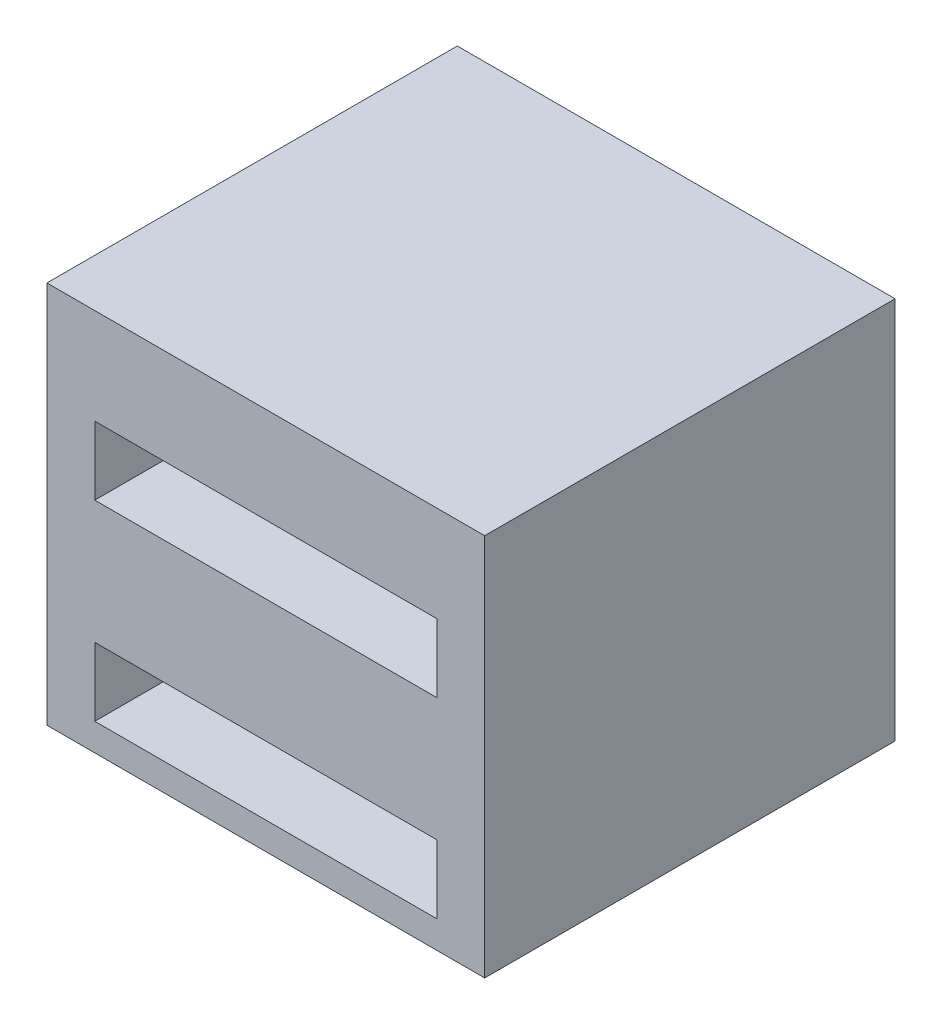
ISO-10303-21;
HEADER;
FILE_DESCRIPTION(('STEP AP214'),'2;1');
FILE_NAME('part.step','',(''),(''),'','','');
FILE_SCHEMA(('AUTOMOTIVE_DESIGN { 1 0 10303 214 1 1 1 1 }'));
ENDSEC;
DATA;
#1=APPLICATION_CONTEXT('core data for automotive mechanical design processes');
#2=APPLICATION_PROTOCOL_DEFINITION('international standard','automotive_design',2000,#1);
#3=PRODUCT_CONTEXT('',#1,'mechanical');
#4=PRODUCT('Part','Part','',(#3));
#5=PRODUCT_RELATED_PRODUCT_CATEGORY('part','',(#4));
#6=PRODUCT_DEFINITION_FORMATION('','',#4);
#7=PRODUCT_DEFINITION_CONTEXT('part definition',#1,'design');
#8=PRODUCT_DEFINITION('design','',#6,#7);
#9=PRODUCT_DEFINITION_SHAPE('','',#8);
#10=(LENGTH_UNIT() NAMED_UNIT(*) SI_UNIT(.MILLI.,.METRE.));
#11=(NAMED_UNIT(*) PLANE_ANGLE_UNIT() SI_UNIT($,.RADIAN.));
#12=(NAMED_UNIT(*) SI_UNIT($,.STERADIAN.) SOLID_ANGLE_UNIT());
#13=UNCERTAINTY_MEASURE_WITH_UNIT(LENGTH_MEASURE(1.E-05),#10,'distance_accuracy_value','');
#14=(GEOMETRIC_REPRESENTATION_CONTEXT(3) GLOBAL_UNCERTAINTY_ASSIGNED_CONTEXT((#13)) GLOBAL_UNIT_ASSIGNED_CONTEXT((#10,
#11,#12)) REPRESENTATION_CONTEXT('',''));
#15=CARTESIAN_POINT('',(0.,0.,0.));
#16=DIRECTION('',(0.,0.,1.));
#17=DIRECTION('',(1.,0.,0.));
#18=AXIS2_PLACEMENT_3D('',#15,#16,#17);
#19=CARTESIAN_POINT('',(30.,1120.,-600.));
#20=DIRECTION('',(-1.,0.,0.));
#21=DIRECTION('',(0.,0.,1.));
#22=AXIS2_PLACEMENT_3D('',#19,#20,#21);
#23=PLANE('',#22);
#24=DIRECTION('',(0.,-1.,0.));
#25=VECTOR('',#24,1.);
#26=CARTESIAN_POINT('',(30.,1120.,0.));
#27=LINE('',#26,#25);
#28=CARTESIAN_POINT('',(30.,1680.,0.));
#29=VERTEX_POINT('',#28);
#30=CARTESIAN_POINT('',(30.,1120.,0.));
#31=VERTEX_POINT('',#30);
#32=EDGE_CURVE('E171',#29,#31,#27,.T.);
#33=ORIENTED_EDGE('',*,*,#32,.F.);
#34=DIRECTION('',(0.,0.,1.));
#35=VECTOR('',#34,1.);
#36=CARTESIAN_POINT('',(30.,1680.,-600.));
#37=LINE('',#36,#35);
#38=CARTESIAN_POINT('',(30.,1680.,-600.));
#39=VERTEX_POINT('',#38);
#40=EDGE_CURVE('E203',#39,#29,#37,.T.);
#41=ORIENTED_EDGE('',*,*,#40,.F.);
#42=DIRECTION('',(0.,-1.,0.));
#43=VECTOR('',#42,1.);
#44=CARTESIAN_POINT('',(30.,1120.,-600.));
#45=LINE('',#44,#43);
#46=CARTESIAN_POINT('',(30.,1120.,-600.));
#47=VERTEX_POINT('',#46);
#48=EDGE_CURVE('E179',#39,#47,#45,.T.);
#49=ORIENTED_EDGE('',*,*,#48,.T.);
#50=DIRECTION('',(0.,0.,1.));
#51=VECTOR('',#50,1.);
#52=CARTESIAN_POINT('',(30.,1120.,-600.));
#53=LINE('',#52,#51);
#54=EDGE_CURVE('E192',#47,#31,#53,.T.);
#55=ORIENTED_EDGE('',*,*,#54,.T.);
#56=EDGE_LOOP('',(#33,#41,#49,#55));
#57=FACE_BOUND('',#56,.T.);
#58=ADVANCED_FACE('F39',(#57),#23,.T.);
#59=CARTESIAN_POINT('',(30.,1680.,-600.));
#60=DIRECTION('',(0.,1.,0.));
#61=DIRECTION('',(0.,0.,1.));
#62=AXIS2_PLACEMENT_3D('',#59,#60,#61);
#63=PLANE('',#62);
#64=DIRECTION('',(-1.,0.,0.));
#65=VECTOR('',#64,1.);
#66=CARTESIAN_POINT('',(30.,1680.,0.));
#67=LINE('',#66,#65);
#68=CARTESIAN_POINT('',(670.,1680.,0.));
#69=VERTEX_POINT('',#68);
#70=EDGE_CURVE('E183',#69,#29,#67,.T.);
#71=ORIENTED_EDGE('',*,*,#70,.F.);
#72=DIRECTION('',(0.,0.,1.));
#73=VECTOR('',#72,1.);
#74=CARTESIAN_POINT('',(670.,1680.,-600.));
#75=LINE('',#74,#73);
#76=CARTESIAN_POINT('',(670.,1680.,-600.));
#77=VERTEX_POINT('',#76);
#78=EDGE_CURVE('E206',#77,#69,#75,.T.);
#79=ORIENTED_EDGE('',*,*,#78,.F.);
#80=DIRECTION('',(-1.,0.,0.));
#81=VECTOR('',#80,1.);
#82=CARTESIAN_POINT('',(30.,1680.,-600.));
#83=LINE('',#82,#81);
#84=EDGE_CURVE('E189',#77,#39,#83,.T.);
#85=ORIENTED_EDGE('',*,*,#84,.T.);
#86=ORIENTED_EDGE('',*,*,#40,.T.);
#87=EDGE_LOOP('',(#71,#79,#85,#86));
#88=FACE_BOUND('',#87,.T.);
#89=ADVANCED_FACE('F243',(#88),#63,.T.);
#90=CARTESIAN_POINT('',(670.,1120.,-600.));
#91=DIRECTION('',(1.,0.,0.));
#92=DIRECTION('',(0.,0.,-1.));
#93=AXIS2_PLACEMENT_3D('',#90,#91,#92);
#94=PLANE('',#93);
#95=DIRECTION('',(0.,1.,0.));
#96=VECTOR('',#95,1.);
#97=CARTESIAN_POINT('',(670.,1120.,0.));
#98=LINE('',#97,#96);
#99=CARTESIAN_POINT('',(670.,1120.,0.));
#100=VERTEX_POINT('',#99);
#101=EDGE_CURVE('E198',#100,#69,#98,.T.);
#102=ORIENTED_EDGE('',*,*,#101,.F.);
#103=DIRECTION('',(0.,0.,1.));
#104=VECTOR('',#103,1.);
#105=CARTESIAN_POINT('',(670.,1120.,-600.));
#106=LINE('',#105,#104);
#107=CARTESIAN_POINT('',(670.,1120.,-600.));
#108=VERTEX_POINT('',#107);
#109=EDGE_CURVE('E208',#108,#100,#106,.T.);
#110=ORIENTED_EDGE('',*,*,#109,.F.);
#111=DIRECTION('',(0.,1.,0.));
#112=VECTOR('',#111,1.);
#113=CARTESIAN_POINT('',(670.,1120.,-600.));
#114=LINE('',#113,#112);
#115=EDGE_CURVE('E186',#108,#77,#114,.T.);
#116=ORIENTED_EDGE('',*,*,#115,.T.);
#117=ORIENTED_EDGE('',*,*,#78,.T.);
#118=EDGE_LOOP('',(#102,#110,#116,#117));
#119=FACE_BOUND('',#118,.T.);
#120=ADVANCED_FACE('F248',(#119),#94,.T.);
#121=CARTESIAN_POINT('',(30.,1120.,-600.));
#122=DIRECTION('',(0.,-1.,0.));
#123=DIRECTION('',(0.,0.,-1.));
#124=AXIS2_PLACEMENT_3D('',#121,#122,#123);
#125=PLANE('',#124);
#126=DIRECTION('',(1.,0.,0.));
#127=VECTOR('',#126,1.);
#128=CARTESIAN_POINT('',(30.,1120.,0.));
#129=LINE('',#128,#127);
#130=EDGE_CURVE('E195',#31,#100,#129,.T.);
#131=ORIENTED_EDGE('',*,*,#130,.F.);
#132=ORIENTED_EDGE('',*,*,#54,.F.);
#133=DIRECTION('',(1.,0.,0.));
#134=VECTOR('',#133,1.);
#135=CARTESIAN_POINT('',(30.,1120.,-600.));
#136=LINE('',#135,#134);
#137=EDGE_CURVE('E182',#47,#108,#136,.T.);
#138=ORIENTED_EDGE('',*,*,#137,.T.);
#139=ORIENTED_EDGE('',*,*,#109,.T.);
#140=EDGE_LOOP('',(#131,#132,#138,#139));
#141=FACE_BOUND('',#140,.T.);
#142=ADVANCED_FACE('F263',(#141),#125,.T.);
#143=CARTESIAN_POINT('',(0.,0.,-600.));
#144=DIRECTION('',(0.,0.,-1.));
#145=DIRECTION('',(-1.,0.,0.));
#146=AXIS2_PLACEMENT_3D('',#143,#144,#145);
#147=PLANE('',#146);
#148=ORIENTED_EDGE('',*,*,#48,.F.);
#149=ORIENTED_EDGE('',*,*,#84,.F.);
#150=ORIENTED_EDGE('',*,*,#115,.F.);
#151=ORIENTED_EDGE('',*,*,#137,.F.);
#152=EDGE_LOOP('',(#148,#149,#150,#151));
#153=FACE_BOUND('',#152,.T.);
#154=ADVANCED_FACE('F260',(#153),#147,.T.);
#155=CARTESIAN_POINT('',(0.,0.,0.));
#156=DIRECTION('',(0.,0.,-1.));
#157=DIRECTION('',(-1.,0.,0.));
#158=AXIS2_PLACEMENT_3D('',#155,#156,#157);
#159=PLANE('',#158);
#160=DIRECTION('',(-1.,0.,0.));
#161=VECTOR('',#160,1.);
#162=CARTESIAN_POINT('',(0.,1440.,0.));
#163=LINE('',#162,#161);
#164=CARTESIAN_POINT('',(600.,1440.,-1.11022302462516E-13));
#165=VERTEX_POINT('',#164);
#166=CARTESIAN_POINT('',(100.,1440.,0.));
#167=VERTEX_POINT('',#166);
#168=EDGE_CURVE('E222',#165,#167,#163,.T.);
#169=ORIENTED_EDGE('',*,*,#168,.T.);
#170=DIRECTION('',(0.,1.,0.));
#171=VECTOR('',#170,1.);
#172=CARTESIAN_POINT('',(100.,0.,0.));
#173=LINE('',#172,#171);
#174=CARTESIAN_POINT('',(100.,1540.,-1.11022302462516E-13));
#175=VERTEX_POINT('',#174);
#176=EDGE_CURVE('E11',#167,#175,#173,.T.);
#177=ORIENTED_EDGE('',*,*,#176,.T.);
#178=DIRECTION('',(1.,0.,0.));
#179=VECTOR('',#178,1.);
#180=CARTESIAN_POINT('',(0.,1540.,0.));
#181=LINE('',#180,#179);
#182=CARTESIAN_POINT('',(600.,1540.,-1.11022302462516E-13));
#183=VERTEX_POINT('',#182);
#184=EDGE_CURVE('E46',#175,#183,#181,.T.);
#185=ORIENTED_EDGE('',*,*,#184,.T.);
#186=DIRECTION('',(0.,-1.,0.));
#187=VECTOR('',#186,1.);
#188=CARTESIAN_POINT('',(600.,0.,0.));
#189=LINE('',#188,#187);
#190=EDGE_CURVE('E224',#183,#165,#189,.T.);
#191=ORIENTED_EDGE('',*,*,#190,.T.);
#192=EDGE_LOOP('',(#169,#177,#185,#191));
#193=FACE_BOUND('',#192,.T.);
#194=DIRECTION('',(-1.,0.,0.));
#195=VECTOR('',#194,1.);
#196=CARTESIAN_POINT('',(0.,1160.,0.));
#197=LINE('',#196,#195);
#198=CARTESIAN_POINT('',(600.,1160.,-1.11022302462516E-13));
#199=VERTEX_POINT('',#198);
#200=CARTESIAN_POINT('',(100.,1160.,0.));
#201=VERTEX_POINT('',#200);
#202=EDGE_CURVE('E205',#199,#201,#197,.T.);
#203=ORIENTED_EDGE('',*,*,#202,.T.);
#204=DIRECTION('',(0.,1.,0.));
#205=VECTOR('',#204,1.);
#206=CARTESIAN_POINT('',(100.,0.,0.));
#207=LINE('',#206,#205);
#208=CARTESIAN_POINT('',(100.,1260.,-1.11022302462516E-13));
#209=VERTEX_POINT('',#208);
#210=EDGE_CURVE('E219',#201,#209,#207,.T.);
#211=ORIENTED_EDGE('',*,*,#210,.T.);
#212=DIRECTION('',(1.,0.,0.));
#213=VECTOR('',#212,1.);
#214=CARTESIAN_POINT('',(0.,1260.,0.));
#215=LINE('',#214,#213);
#216=CARTESIAN_POINT('',(600.,1260.,-1.11022302462516E-13));
#217=VERTEX_POINT('',#216);
#218=EDGE_CURVE('E216',#209,#217,#215,.T.);
#219=ORIENTED_EDGE('',*,*,#218,.T.);
#220=DIRECTION('',(0.,-1.,0.));
#221=VECTOR('',#220,1.);
#222=CARTESIAN_POINT('',(600.,0.,0.));
#223=LINE('',#222,#221);
#224=EDGE_CURVE('E213',#217,#199,#223,.T.);
#225=ORIENTED_EDGE('',*,*,#224,.T.);
#226=EDGE_LOOP('',(#203,#211,#219,#225));
#227=FACE_BOUND('',#226,.T.);
#228=ORIENTED_EDGE('',*,*,#32,.T.);
#229=ORIENTED_EDGE('',*,*,#130,.T.);
#230=ORIENTED_EDGE('',*,*,#101,.T.);
#231=ORIENTED_EDGE('',*,*,#70,.T.);
#232=EDGE_LOOP('',(#228,#229,#230,#231));
#233=FACE_BOUND('',#232,.T.);
#234=ADVANCED_FACE('F228',(#193,#227,#233),#159,.F.);
#235=CARTESIAN_POINT('',(100.,1160.,-420.));
#236=DIRECTION('',(-1.,0.,0.));
#237=DIRECTION('',(0.,0.,1.));
#238=AXIS2_PLACEMENT_3D('',#235,#236,#237);
#239=PLANE('',#238);
#240=DIRECTION('',(0.,0.,1.));
#241=VECTOR('',#240,1.);
#242=CARTESIAN_POINT('',(100.,1160.,-420.));
#243=LINE('',#242,#241);
#244=CARTESIAN_POINT('',(100.,1160.,-420.));
#245=VERTEX_POINT('',#244);
#246=EDGE_CURVE('E61',#245,#201,#243,.T.);
#247=ORIENTED_EDGE('',*,*,#246,.F.);
#248=DIRECTION('',(0.,-1.,0.));
#249=VECTOR('',#248,1.);
#250=CARTESIAN_POINT('',(100.,1160.,-420.));
#251=LINE('',#250,#249);
#252=CARTESIAN_POINT('',(100.,1260.,-420.));
#253=VERTEX_POINT('',#252);
#254=EDGE_CURVE('E152',#253,#245,#251,.T.);
#255=ORIENTED_EDGE('',*,*,#254,.F.);
#256=DIRECTION('',(0.,0.,1.));
#257=VECTOR('',#256,1.);
#258=CARTESIAN_POINT('',(100.,1260.,-420.));
#259=LINE('',#258,#257);
#260=EDGE_CURVE('E168',#253,#209,#259,.T.);
#261=ORIENTED_EDGE('',*,*,#260,.T.);
#262=ORIENTED_EDGE('',*,*,#210,.F.);
#263=EDGE_LOOP('',(#247,#255,#261,#262));
#264=FACE_BOUND('',#263,.T.);
#265=ADVANCED_FACE('F273',(#264),#239,.F.);
#266=CARTESIAN_POINT('',(100.,1260.,-420.));
#267=DIRECTION('',(0.,1.,0.));
#268=DIRECTION('',(0.,0.,1.));
#269=AXIS2_PLACEMENT_3D('',#266,#267,#268);
#270=PLANE('',#269);
#271=ORIENTED_EDGE('',*,*,#260,.F.);
#272=DIRECTION('',(-1.,0.,0.));
#273=VECTOR('',#272,1.);
#274=CARTESIAN_POINT('',(100.,1260.,-420.));
#275=LINE('',#274,#273);
#276=CARTESIAN_POINT('',(600.,1260.,-420.));
#277=VERTEX_POINT('',#276);
#278=EDGE_CURVE('E165',#277,#253,#275,.T.);
#279=ORIENTED_EDGE('',*,*,#278,.F.);
#280=DIRECTION('',(0.,0.,1.));
#281=VECTOR('',#280,1.);
#282=CARTESIAN_POINT('',(600.,1260.,-420.));
#283=LINE('',#282,#281);
#284=EDGE_CURVE('E172',#277,#217,#283,.T.);
#285=ORIENTED_EDGE('',*,*,#284,.T.);
#286=ORIENTED_EDGE('',*,*,#218,.F.);
#287=EDGE_LOOP('',(#271,#279,#285,#286));
#288=FACE_BOUND('',#287,.T.);
#289=ADVANCED_FACE('F278',(#288),#270,.F.);
#290=CARTESIAN_POINT('',(600.,1160.,-420.));
#291=DIRECTION('',(1.,0.,0.));
#292=DIRECTION('',(0.,0.,-1.));
#293=AXIS2_PLACEMENT_3D('',#290,#291,#292);
#294=PLANE('',#293);
#295=ORIENTED_EDGE('',*,*,#284,.F.);
#296=DIRECTION('',(0.,1.,0.));
#297=VECTOR('',#296,1.);
#298=CARTESIAN_POINT('',(600.,1160.,-420.));
#299=LINE('',#298,#297);
#300=CARTESIAN_POINT('',(600.,1160.,-420.));
#301=VERTEX_POINT('',#300);
#302=EDGE_CURVE('E162',#301,#277,#299,.T.);
#303=ORIENTED_EDGE('',*,*,#302,.F.);
#304=DIRECTION('',(0.,0.,1.));
#305=VECTOR('',#304,1.);
#306=CARTESIAN_POINT('',(600.,1160.,-420.));
#307=LINE('',#306,#305);
#308=EDGE_CURVE('E175',#301,#199,#307,.T.);
#309=ORIENTED_EDGE('',*,*,#308,.T.);
#310=ORIENTED_EDGE('',*,*,#224,.F.);
#311=EDGE_LOOP('',(#295,#303,#309,#310));
#312=FACE_BOUND('',#311,.T.);
#313=ADVANCED_FACE('F284',(#312),#294,.F.);
#314=CARTESIAN_POINT('',(100.,1160.,-420.));
#315=DIRECTION('',(0.,-1.,0.));
#316=DIRECTION('',(0.,0.,-1.));
#317=AXIS2_PLACEMENT_3D('',#314,#315,#316);
#318=PLANE('',#317);
#319=ORIENTED_EDGE('',*,*,#308,.F.);
#320=DIRECTION('',(1.,0.,0.));
#321=VECTOR('',#320,1.);
#322=CARTESIAN_POINT('',(100.,1160.,-420.));
#323=LINE('',#322,#321);
#324=EDGE_CURVE('E159',#245,#301,#323,.T.);
#325=ORIENTED_EDGE('',*,*,#324,.F.);
#326=ORIENTED_EDGE('',*,*,#246,.T.);
#327=ORIENTED_EDGE('',*,*,#202,.F.);
#328=EDGE_LOOP('',(#319,#325,#326,#327));
#329=FACE_BOUND('',#328,.T.);
#330=ADVANCED_FACE('F280',(#329),#318,.F.);
#331=CARTESIAN_POINT('',(0.,0.,-420.));
#332=DIRECTION('',(0.,0.,-1.));
#333=DIRECTION('',(-1.,0.,0.));
#334=AXIS2_PLACEMENT_3D('',#331,#332,#333);
#335=PLANE('',#334);
#336=ORIENTED_EDGE('',*,*,#254,.T.);
#337=ORIENTED_EDGE('',*,*,#324,.T.);
#338=ORIENTED_EDGE('',*,*,#302,.T.);
#339=ORIENTED_EDGE('',*,*,#278,.T.);
#340=EDGE_LOOP('',(#336,#337,#338,#339));
#341=FACE_BOUND('',#340,.T.);
#342=ADVANCED_FACE('F283',(#341),#335,.F.);
#343=CARTESIAN_POINT('',(100.,1440.,-420.));
#344=DIRECTION('',(-1.,0.,0.));
#345=DIRECTION('',(0.,0.,1.));
#346=AXIS2_PLACEMENT_3D('',#343,#344,#345);
#347=PLANE('',#346);
#348=DIRECTION('',(0.,0.,1.));
#349=VECTOR('',#348,1.);
#350=CARTESIAN_POINT('',(100.,1440.,-420.));
#351=LINE('',#350,#349);
#352=CARTESIAN_POINT('',(100.,1440.,-420.));
#353=VERTEX_POINT('',#352);
#354=EDGE_CURVE('E53',#353,#167,#351,.T.);
#355=ORIENTED_EDGE('',*,*,#354,.F.);
#356=DIRECTION('',(0.,-1.,0.));
#357=VECTOR('',#356,1.);
#358=CARTESIAN_POINT('',(100.,1440.,-420.));
#359=LINE('',#358,#357);
#360=CARTESIAN_POINT('',(100.,1540.,-420.));
#361=VERTEX_POINT('',#360);
#362=EDGE_CURVE('E129',#361,#353,#359,.T.);
#363=ORIENTED_EDGE('',*,*,#362,.F.);
#364=DIRECTION('',(0.,0.,1.));
#365=VECTOR('',#364,1.);
#366=CARTESIAN_POINT('',(100.,1540.,-420.));
#367=LINE('',#366,#365);
#368=EDGE_CURVE('E150',#361,#175,#367,.T.);
#369=ORIENTED_EDGE('',*,*,#368,.T.);
#370=ORIENTED_EDGE('',*,*,#176,.F.);
#371=EDGE_LOOP('',(#355,#363,#369,#370));
#372=FACE_BOUND('',#371,.T.);
#373=ADVANCED_FACE('F126',(#372),#347,.F.);
#374=CARTESIAN_POINT('',(100.,1540.,-420.));
#375=DIRECTION('',(0.,1.,0.));
#376=DIRECTION('',(0.,0.,1.));
#377=AXIS2_PLACEMENT_3D('',#374,#375,#376);
#378=PLANE('',#377);
#379=ORIENTED_EDGE('',*,*,#368,.F.);
#380=DIRECTION('',(-1.,0.,0.));
#381=VECTOR('',#380,1.);
#382=CARTESIAN_POINT('',(100.,1540.,-420.));
#383=LINE('',#382,#381);
#384=CARTESIAN_POINT('',(600.,1540.,-420.));
#385=VERTEX_POINT('',#384);
#386=EDGE_CURVE('E133',#385,#361,#383,.T.);
#387=ORIENTED_EDGE('',*,*,#386,.F.);
#388=DIRECTION('',(0.,0.,1.));
#389=VECTOR('',#388,1.);
#390=CARTESIAN_POINT('',(600.,1540.,-420.));
#391=LINE('',#390,#389);
#392=EDGE_CURVE('E153',#385,#183,#391,.T.);
#393=ORIENTED_EDGE('',*,*,#392,.T.);
#394=ORIENTED_EDGE('',*,*,#184,.F.);
#395=EDGE_LOOP('',(#379,#387,#393,#394));
#396=FACE_BOUND('',#395,.T.);
#397=ADVANCED_FACE('F231',(#396),#378,.F.);
#398=CARTESIAN_POINT('',(600.,1440.,-420.));
#399=DIRECTION('',(1.,0.,0.));
#400=DIRECTION('',(0.,0.,-1.));
#401=AXIS2_PLACEMENT_3D('',#398,#399,#400);
#402=PLANE('',#401);
#403=ORIENTED_EDGE('',*,*,#392,.F.);
#404=DIRECTION('',(0.,1.,0.));
#405=VECTOR('',#404,1.);
#406=CARTESIAN_POINT('',(600.,1440.,-420.));
#407=LINE('',#406,#405);
#408=CARTESIAN_POINT('',(600.,1440.,-420.));
#409=VERTEX_POINT('',#408);
#410=EDGE_CURVE('E142',#409,#385,#407,.T.);
#411=ORIENTED_EDGE('',*,*,#410,.F.);
#412=DIRECTION('',(0.,0.,1.));
#413=VECTOR('',#412,1.);
#414=CARTESIAN_POINT('',(600.,1440.,-420.));
#415=LINE('',#414,#413);
#416=EDGE_CURVE('E132',#409,#165,#415,.T.);
#417=ORIENTED_EDGE('',*,*,#416,.T.);
#418=ORIENTED_EDGE('',*,*,#190,.F.);
#419=EDGE_LOOP('',(#403,#411,#417,#418));
#420=FACE_BOUND('',#419,.T.);
#421=ADVANCED_FACE('F233',(#420),#402,.F.);
#422=CARTESIAN_POINT('',(100.,1440.,-420.));
#423=DIRECTION('',(0.,-1.,0.));
#424=DIRECTION('',(0.,0.,-1.));
#425=AXIS2_PLACEMENT_3D('',#422,#423,#424);
#426=PLANE('',#425);
#427=ORIENTED_EDGE('',*,*,#416,.F.);
#428=DIRECTION('',(1.,0.,0.));
#429=VECTOR('',#428,1.);
#430=CARTESIAN_POINT('',(100.,1440.,-420.));
#431=LINE('',#430,#429);
#432=EDGE_CURVE('E136',#353,#409,#431,.T.);
#433=ORIENTED_EDGE('',*,*,#432,.F.);
#434=ORIENTED_EDGE('',*,*,#354,.T.);
#435=ORIENTED_EDGE('',*,*,#168,.F.);
#436=EDGE_LOOP('',(#427,#433,#434,#435));
#437=FACE_BOUND('',#436,.T.);
#438=ADVANCED_FACE('F137',(#437),#426,.F.);
#439=CARTESIAN_POINT('',(0.,0.,-420.));
#440=DIRECTION('',(0.,0.,-1.));
#441=DIRECTION('',(-1.,0.,0.));
#442=AXIS2_PLACEMENT_3D('',#439,#440,#441);
#443=PLANE('',#442);
#444=ORIENTED_EDGE('',*,*,#362,.T.);
#445=ORIENTED_EDGE('',*,*,#432,.T.);
#446=ORIENTED_EDGE('',*,*,#410,.T.);
#447=ORIENTED_EDGE('',*,*,#386,.T.);
#448=EDGE_LOOP('',(#444,#445,#446,#447));
#449=FACE_BOUND('',#448,.T.);
#450=ADVANCED_FACE('F144',(#449),#443,.F.);
#451=CLOSED_SHELL('',(#58,#89,#120,#142,#154,#234,#265,#289,#313,#330,#342,#373,#397,#421,#438,#450));
#452=MANIFOLD_SOLID_BREP('B2',#451);
#453=ADVANCED_BREP_SHAPE_REPRESENTATION('',(#18,#452),#14);
#454=SHAPE_DEFINITION_REPRESENTATION(#9,#453);
ENDSEC;
END-ISO-10303-21;
